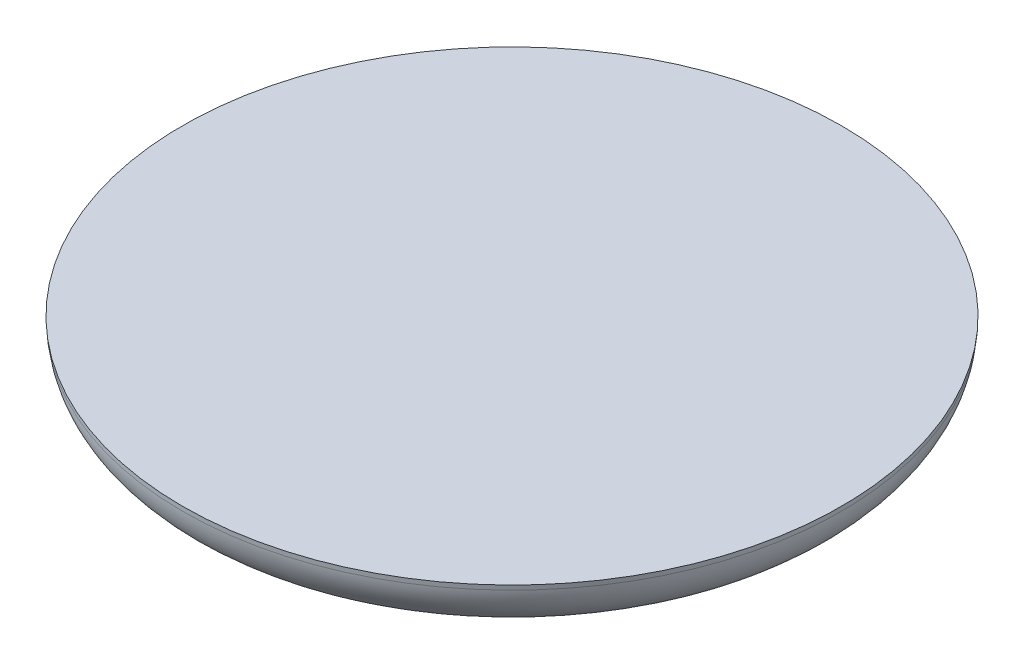
ISO-10303-21;
HEADER;
FILE_DESCRIPTION(('STEP AP214'),'2;1');
FILE_NAME('part.step','',(''),(''),'','','');
FILE_SCHEMA(('AUTOMOTIVE_DESIGN { 1 0 10303 214 1 1 1 1 }'));
ENDSEC;
DATA;
#1=APPLICATION_CONTEXT('core data for automotive mechanical design processes');
#2=APPLICATION_PROTOCOL_DEFINITION('international standard','automotive_design',2000,#1);
#3=PRODUCT_CONTEXT('',#1,'mechanical');
#4=PRODUCT('Part','Part','',(#3));
#5=PRODUCT_RELATED_PRODUCT_CATEGORY('part','',(#4));
#6=PRODUCT_DEFINITION_FORMATION('','',#4);
#7=PRODUCT_DEFINITION_CONTEXT('part definition',#1,'design');
#8=PRODUCT_DEFINITION('design','',#6,#7);
#9=PRODUCT_DEFINITION_SHAPE('','',#8);
#10=(LENGTH_UNIT() NAMED_UNIT(*) SI_UNIT(.MILLI.,.METRE.));
#11=(NAMED_UNIT(*) PLANE_ANGLE_UNIT() SI_UNIT($,.RADIAN.));
#12=(NAMED_UNIT(*) SI_UNIT($,.STERADIAN.) SOLID_ANGLE_UNIT());
#13=UNCERTAINTY_MEASURE_WITH_UNIT(LENGTH_MEASURE(1.E-05),#10,'distance_accuracy_value','');
#14=(GEOMETRIC_REPRESENTATION_CONTEXT(3) GLOBAL_UNCERTAINTY_ASSIGNED_CONTEXT((#13)) GLOBAL_UNIT_ASSIGNED_CONTEXT((#10,
#11,#12)) REPRESENTATION_CONTEXT('',''));
#15=CARTESIAN_POINT('',(0.,0.,0.));
#16=DIRECTION('',(0.,0.,1.));
#17=DIRECTION('',(1.,0.,0.));
#18=AXIS2_PLACEMENT_3D('',#15,#16,#17);
#19=CARTESIAN_POINT('',(0.,0.,0.));
#20=DIRECTION('',(0.,1.,0.));
#21=DIRECTION('',(0.,0.,1.));
#22=AXIS2_PLACEMENT_3D('',#19,#20,#21);
#23=CONICAL_SURFACE('',#22,38.1,0.0872664625997167);
#24=CARTESIAN_POINT('',(0.,5.79656103355242,0.));
#25=DIRECTION('',(0.,-1.,0.));
#26=DIRECTION('',(0.,0.,-1.));
#27=AXIS2_PLACEMENT_3D('',#24,#25,#26);
#28=CIRCLE('',#27,38.607133377872);
#29=CARTESIAN_POINT('',(0.,5.79656103355242,-38.607133377872));
#30=VERTEX_POINT('',#29);
#31=EDGE_CURVE('E37',#30,#30,#28,.F.);
#32=ORIENTED_EDGE('',*,*,#31,.T.);
#33=EDGE_LOOP('',(#32));
#34=FACE_BOUND('',#33,.T.);
#35=CARTESIAN_POINT('',(0.,6.35,0.));
#36=DIRECTION('',(0.,1.,0.));
#37=DIRECTION('',(0.,0.,1.));
#38=AXIS2_PLACEMENT_3D('',#35,#36,#37);
#39=CIRCLE('',#38,38.6555530133896);
#40=CARTESIAN_POINT('',(0.,6.35,38.6555530133896));
#41=VERTEX_POINT('',#40);
#42=EDGE_CURVE('E41',#41,#41,#39,.T.);
#43=ORIENTED_EDGE('',*,*,#42,.F.);
#44=EDGE_LOOP('',(#43));
#45=FACE_BOUND('',#44,.T.);
#46=ADVANCED_FACE('F30',(#34,#45),#23,.T.);
#47=CARTESIAN_POINT('',(0.,6.35,0.));
#48=DIRECTION('',(0.,1.,0.));
#49=DIRECTION('',(0.,0.,1.));
#50=AXIS2_PLACEMENT_3D('',#47,#48,#49);
#51=PLANE('',#50);
#52=ORIENTED_EDGE('',*,*,#42,.T.);
#53=EDGE_LOOP('',(#52));
#54=FACE_BOUND('',#53,.T.);
#55=ADVANCED_FACE('F48',(#54),#51,.T.);
#56=CARTESIAN_POINT('',(0.,0.,0.));
#57=DIRECTION('',(0.,1.,0.));
#58=DIRECTION('',(0.,0.,1.));
#59=AXIS2_PLACEMENT_3D('',#56,#57,#58);
#60=PLANE('',#59);
#61=CARTESIAN_POINT('',(0.,0.,0.));
#62=DIRECTION('',(0.,1.,0.));
#63=DIRECTION('',(0.,0.,1.));
#64=AXIS2_PLACEMENT_3D('',#61,#62,#63);
#65=CIRCLE('',#64,32.2812970449894);
#66=CARTESIAN_POINT('',(0.,0.,32.2812970449894));
#67=VERTEX_POINT('',#66);
#68=EDGE_CURVE('E10',#67,#67,#65,.F.);
#69=ORIENTED_EDGE('',*,*,#68,.T.);
#70=EDGE_LOOP('',(#69));
#71=FACE_BOUND('',#70,.T.);
#72=ADVANCED_FACE('F54',(#71),#60,.F.);
#73=CARTESIAN_POINT('',(0.,6.35,0.));
#74=DIRECTION('',(0.,1.,0.));
#75=DIRECTION('',(0.,0.,1.));
#76=AXIS2_PLACEMENT_3D('',#73,#74,#75);
#77=TOROIDAL_SURFACE('',#76,32.2812970449894,6.35);
#78=ORIENTED_EDGE('',*,*,#68,.F.);
#79=EDGE_LOOP('',(#78));
#80=FACE_BOUND('',#79,.T.);
#81=ORIENTED_EDGE('',*,*,#31,.F.);
#82=EDGE_LOOP('',(#81));
#83=FACE_BOUND('',#82,.T.);
#84=ADVANCED_FACE('F32',(#80,#83),#77,.T.);
#85=CLOSED_SHELL('',(#46,#55,#72,#84));
#86=MANIFOLD_SOLID_BREP('B2',#85);
#87=ADVANCED_BREP_SHAPE_REPRESENTATION('',(#18,#86),#14);
#88=SHAPE_DEFINITION_REPRESENTATION(#9,#87);
ENDSEC;
END-ISO-10303-21;
